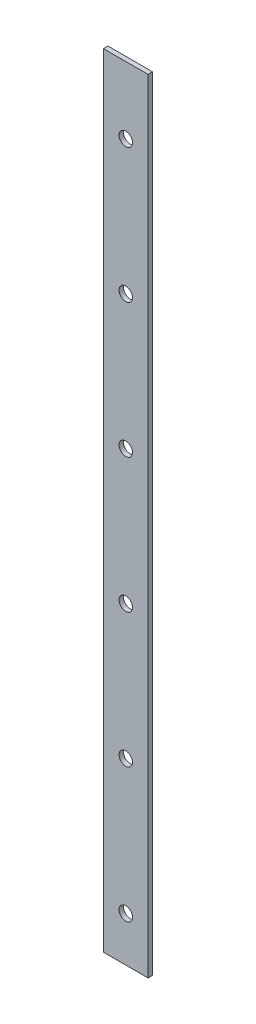
ISO-10303-21;
HEADER;
FILE_DESCRIPTION(('STEP AP214'),'2;1');
FILE_NAME('part.step','',(''),(''),'','','');
FILE_SCHEMA(('AUTOMOTIVE_DESIGN { 1 0 10303 214 1 1 1 1 }'));
ENDSEC;
DATA;
#1=APPLICATION_CONTEXT('core data for automotive mechanical design processes');
#2=APPLICATION_PROTOCOL_DEFINITION('international standard','automotive_design',2000,#1);
#3=PRODUCT_CONTEXT('',#1,'mechanical');
#4=PRODUCT('Part','Part','',(#3));
#5=PRODUCT_RELATED_PRODUCT_CATEGORY('part','',(#4));
#6=PRODUCT_DEFINITION_FORMATION('','',#4);
#7=PRODUCT_DEFINITION_CONTEXT('part definition',#1,'design');
#8=PRODUCT_DEFINITION('design','',#6,#7);
#9=PRODUCT_DEFINITION_SHAPE('','',#8);
#10=(LENGTH_UNIT() NAMED_UNIT(*) SI_UNIT(.MILLI.,.METRE.));
#11=(NAMED_UNIT(*) PLANE_ANGLE_UNIT() SI_UNIT($,.RADIAN.));
#12=(NAMED_UNIT(*) SI_UNIT($,.STERADIAN.) SOLID_ANGLE_UNIT());
#13=UNCERTAINTY_MEASURE_WITH_UNIT(LENGTH_MEASURE(1.E-05),#10,'distance_accuracy_value','');
#14=(GEOMETRIC_REPRESENTATION_CONTEXT(3) GLOBAL_UNCERTAINTY_ASSIGNED_CONTEXT((#13)) GLOBAL_UNIT_ASSIGNED_CONTEXT((#10,
#11,#12)) REPRESENTATION_CONTEXT('',''));
#15=CARTESIAN_POINT('',(0.,0.,0.));
#16=DIRECTION('',(0.,0.,1.));
#17=DIRECTION('',(1.,0.,0.));
#18=AXIS2_PLACEMENT_3D('',#15,#16,#17);
#19=CARTESIAN_POINT('',(0.,320.,-8.));
#20=DIRECTION('',(0.,0.,1.));
#21=DIRECTION('',(1.,0.,0.));
#22=AXIS2_PLACEMENT_3D('',#19,#20,#21);
#23=CYLINDRICAL_SURFACE('',#22,3.);
#24=CARTESIAN_POINT('',(0.,320.,0.));
#25=DIRECTION('',(0.,0.,-1.));
#26=DIRECTION('',(-1.,0.,0.));
#27=AXIS2_PLACEMENT_3D('',#24,#25,#26);
#28=CIRCLE('',#27,3.);
#29=CARTESIAN_POINT('',(-3.,320.,0.));
#30=VERTEX_POINT('',#29);
#31=EDGE_CURVE('E41',#30,#30,#28,.T.);
#32=ORIENTED_EDGE('',*,*,#31,.T.);
#33=EDGE_LOOP('',(#32));
#34=FACE_BOUND('',#33,.T.);
#35=CARTESIAN_POINT('',(0.,320.,2.));
#36=DIRECTION('',(0.,0.,1.));
#37=DIRECTION('',(1.,0.,0.));
#38=AXIS2_PLACEMENT_3D('',#35,#36,#37);
#39=CIRCLE('',#38,3.);
#40=CARTESIAN_POINT('',(3.,320.,2.));
#41=VERTEX_POINT('',#40);
#42=EDGE_CURVE('E11',#41,#41,#39,.T.);
#43=ORIENTED_EDGE('',*,*,#42,.T.);
#44=EDGE_LOOP('',(#43));
#45=FACE_BOUND('',#44,.T.);
#46=ADVANCED_FACE('F33',(#34,#45),#23,.F.);
#47=CARTESIAN_POINT('',(0.,260.,-8.));
#48=DIRECTION('',(0.,0.,1.));
#49=DIRECTION('',(1.,0.,0.));
#50=AXIS2_PLACEMENT_3D('',#47,#48,#49);
#51=CYLINDRICAL_SURFACE('',#50,3.);
#52=CARTESIAN_POINT('',(0.,260.,0.));
#53=DIRECTION('',(0.,0.,-1.));
#54=DIRECTION('',(-1.,0.,0.));
#55=AXIS2_PLACEMENT_3D('',#52,#53,#54);
#56=CIRCLE('',#55,3.);
#57=CARTESIAN_POINT('',(-3.,260.,0.));
#58=VERTEX_POINT('',#57);
#59=EDGE_CURVE('E126',#58,#58,#56,.T.);
#60=ORIENTED_EDGE('',*,*,#59,.T.);
#61=EDGE_LOOP('',(#60));
#62=FACE_BOUND('',#61,.T.);
#63=CARTESIAN_POINT('',(0.,260.,2.));
#64=DIRECTION('',(0.,0.,1.));
#65=DIRECTION('',(1.,0.,0.));
#66=AXIS2_PLACEMENT_3D('',#63,#64,#65);
#67=CIRCLE('',#66,3.);
#68=CARTESIAN_POINT('',(3.,260.,2.));
#69=VERTEX_POINT('',#68);
#70=EDGE_CURVE('E129',#69,#69,#67,.T.);
#71=ORIENTED_EDGE('',*,*,#70,.T.);
#72=EDGE_LOOP('',(#71));
#73=FACE_BOUND('',#72,.T.);
#74=ADVANCED_FACE('F155',(#62,#73),#51,.F.);
#75=CARTESIAN_POINT('',(0.,200.,-8.));
#76=DIRECTION('',(0.,0.,1.));
#77=DIRECTION('',(1.,0.,0.));
#78=AXIS2_PLACEMENT_3D('',#75,#76,#77);
#79=CYLINDRICAL_SURFACE('',#78,3.);
#80=CARTESIAN_POINT('',(0.,200.,0.));
#81=DIRECTION('',(0.,0.,-1.));
#82=DIRECTION('',(-1.,0.,0.));
#83=AXIS2_PLACEMENT_3D('',#80,#81,#82);
#84=CIRCLE('',#83,3.);
#85=CARTESIAN_POINT('',(-3.,200.,0.));
#86=VERTEX_POINT('',#85);
#87=EDGE_CURVE('E120',#86,#86,#84,.T.);
#88=ORIENTED_EDGE('',*,*,#87,.T.);
#89=EDGE_LOOP('',(#88));
#90=FACE_BOUND('',#89,.T.);
#91=CARTESIAN_POINT('',(0.,200.,2.));
#92=DIRECTION('',(0.,0.,1.));
#93=DIRECTION('',(1.,0.,0.));
#94=AXIS2_PLACEMENT_3D('',#91,#92,#93);
#95=CIRCLE('',#94,3.);
#96=CARTESIAN_POINT('',(3.,200.,2.));
#97=VERTEX_POINT('',#96);
#98=EDGE_CURVE('E123',#97,#97,#95,.T.);
#99=ORIENTED_EDGE('',*,*,#98,.T.);
#100=EDGE_LOOP('',(#99));
#101=FACE_BOUND('',#100,.T.);
#102=ADVANCED_FACE('F159',(#90,#101),#79,.F.);
#103=CARTESIAN_POINT('',(0.,140.,-8.));
#104=DIRECTION('',(0.,0.,1.));
#105=DIRECTION('',(1.,0.,0.));
#106=AXIS2_PLACEMENT_3D('',#103,#104,#105);
#107=CYLINDRICAL_SURFACE('',#106,3.);
#108=CARTESIAN_POINT('',(0.,140.,0.));
#109=DIRECTION('',(0.,0.,-1.));
#110=DIRECTION('',(-1.,0.,0.));
#111=AXIS2_PLACEMENT_3D('',#108,#109,#110);
#112=CIRCLE('',#111,3.);
#113=CARTESIAN_POINT('',(-3.,140.,0.));
#114=VERTEX_POINT('',#113);
#115=EDGE_CURVE('E111',#114,#114,#112,.T.);
#116=ORIENTED_EDGE('',*,*,#115,.T.);
#117=EDGE_LOOP('',(#116));
#118=FACE_BOUND('',#117,.T.);
#119=CARTESIAN_POINT('',(0.,140.,2.));
#120=DIRECTION('',(0.,0.,1.));
#121=DIRECTION('',(1.,0.,0.));
#122=AXIS2_PLACEMENT_3D('',#119,#120,#121);
#123=CIRCLE('',#122,3.);
#124=CARTESIAN_POINT('',(3.,140.,2.));
#125=VERTEX_POINT('',#124);
#126=EDGE_CURVE('E117',#125,#125,#123,.T.);
#127=ORIENTED_EDGE('',*,*,#126,.T.);
#128=EDGE_LOOP('',(#127));
#129=FACE_BOUND('',#128,.T.);
#130=ADVANCED_FACE('F164',(#118,#129),#107,.F.);
#131=CARTESIAN_POINT('',(-10.,0.,2.));
#132=DIRECTION('',(1.,0.,0.));
#133=DIRECTION('',(0.,0.,-1.));
#134=AXIS2_PLACEMENT_3D('',#131,#132,#133);
#135=PLANE('',#134);
#136=DIRECTION('',(0.,-1.,0.));
#137=VECTOR('',#136,1.);
#138=CARTESIAN_POINT('',(-10.,0.,0.));
#139=LINE('',#138,#137);
#140=CARTESIAN_POINT('',(-10.,350.,0.));
#141=VERTEX_POINT('',#140);
#142=CARTESIAN_POINT('',(-10.,0.,0.));
#143=VERTEX_POINT('',#142);
#144=EDGE_CURVE('E101',#141,#143,#139,.T.);
#145=ORIENTED_EDGE('',*,*,#144,.T.);
#146=DIRECTION('',(0.,0.,-1.));
#147=VECTOR('',#146,1.);
#148=CARTESIAN_POINT('',(-10.,0.,2.));
#149=LINE('',#148,#147);
#150=CARTESIAN_POINT('',(-10.,0.,2.));
#151=VERTEX_POINT('',#150);
#152=EDGE_CURVE('E92',#151,#143,#149,.T.);
#153=ORIENTED_EDGE('',*,*,#152,.F.);
#154=DIRECTION('',(0.,-1.,0.));
#155=VECTOR('',#154,1.);
#156=CARTESIAN_POINT('',(-10.,0.,2.));
#157=LINE('',#156,#155);
#158=CARTESIAN_POINT('',(-10.,350.,2.));
#159=VERTEX_POINT('',#158);
#160=EDGE_CURVE('E86',#159,#151,#157,.T.);
#161=ORIENTED_EDGE('',*,*,#160,.F.);
#162=DIRECTION('',(0.,0.,-1.));
#163=VECTOR('',#162,1.);
#164=CARTESIAN_POINT('',(-10.,350.,2.));
#165=LINE('',#164,#163);
#166=EDGE_CURVE('E97',#159,#141,#165,.T.);
#167=ORIENTED_EDGE('',*,*,#166,.T.);
#168=EDGE_LOOP('',(#145,#153,#161,#167));
#169=FACE_BOUND('',#168,.T.);
#170=ADVANCED_FACE('F171',(#169),#135,.F.);
#171=CARTESIAN_POINT('',(-10.,0.,2.));
#172=DIRECTION('',(0.,1.,0.));
#173=DIRECTION('',(0.,0.,1.));
#174=AXIS2_PLACEMENT_3D('',#171,#172,#173);
#175=PLANE('',#174);
#176=DIRECTION('',(1.,0.,0.));
#177=VECTOR('',#176,1.);
#178=CARTESIAN_POINT('',(-10.,0.,0.));
#179=LINE('',#178,#177);
#180=CARTESIAN_POINT('',(10.,0.,0.));
#181=VERTEX_POINT('',#180);
#182=EDGE_CURVE('E91',#143,#181,#179,.T.);
#183=ORIENTED_EDGE('',*,*,#182,.T.);
#184=DIRECTION('',(0.,0.,-1.));
#185=VECTOR('',#184,1.);
#186=CARTESIAN_POINT('',(10.,0.,2.));
#187=LINE('',#186,#185);
#188=CARTESIAN_POINT('',(10.,0.,2.));
#189=VERTEX_POINT('',#188);
#190=EDGE_CURVE('E89',#189,#181,#187,.T.);
#191=ORIENTED_EDGE('',*,*,#190,.F.);
#192=DIRECTION('',(1.,0.,0.));
#193=VECTOR('',#192,1.);
#194=CARTESIAN_POINT('',(-10.,0.,2.));
#195=LINE('',#194,#193);
#196=EDGE_CURVE('E80',#151,#189,#195,.T.);
#197=ORIENTED_EDGE('',*,*,#196,.F.);
#198=ORIENTED_EDGE('',*,*,#152,.T.);
#199=EDGE_LOOP('',(#183,#191,#197,#198));
#200=FACE_BOUND('',#199,.T.);
#201=ADVANCED_FACE('F90',(#200),#175,.F.);
#202=CARTESIAN_POINT('',(10.,0.,2.));
#203=DIRECTION('',(-1.,0.,0.));
#204=DIRECTION('',(0.,0.,1.));
#205=AXIS2_PLACEMENT_3D('',#202,#203,#204);
#206=PLANE('',#205);
#207=DIRECTION('',(0.,1.,0.));
#208=VECTOR('',#207,1.);
#209=CARTESIAN_POINT('',(10.,0.,0.));
#210=LINE('',#209,#208);
#211=CARTESIAN_POINT('',(10.,350.,0.));
#212=VERTEX_POINT('',#211);
#213=EDGE_CURVE('E66',#181,#212,#210,.T.);
#214=ORIENTED_EDGE('',*,*,#213,.T.);
#215=DIRECTION('',(0.,0.,-1.));
#216=VECTOR('',#215,1.);
#217=CARTESIAN_POINT('',(10.,350.,2.));
#218=LINE('',#217,#216);
#219=CARTESIAN_POINT('',(10.,350.,2.));
#220=VERTEX_POINT('',#219);
#221=EDGE_CURVE('E93',#220,#212,#218,.T.);
#222=ORIENTED_EDGE('',*,*,#221,.F.);
#223=DIRECTION('',(0.,1.,0.));
#224=VECTOR('',#223,1.);
#225=CARTESIAN_POINT('',(10.,0.,2.));
#226=LINE('',#225,#224);
#227=EDGE_CURVE('E84',#189,#220,#226,.T.);
#228=ORIENTED_EDGE('',*,*,#227,.F.);
#229=ORIENTED_EDGE('',*,*,#190,.T.);
#230=EDGE_LOOP('',(#214,#222,#228,#229));
#231=FACE_BOUND('',#230,.T.);
#232=ADVANCED_FACE('F95',(#231),#206,.F.);
#233=CARTESIAN_POINT('',(-10.,350.,2.));
#234=DIRECTION('',(0.,-1.,0.));
#235=DIRECTION('',(0.,0.,-1.));
#236=AXIS2_PLACEMENT_3D('',#233,#234,#235);
#237=PLANE('',#236);
#238=DIRECTION('',(-1.,0.,0.));
#239=VECTOR('',#238,1.);
#240=CARTESIAN_POINT('',(-10.,350.,0.));
#241=LINE('',#240,#239);
#242=EDGE_CURVE('E72',#212,#141,#241,.T.);
#243=ORIENTED_EDGE('',*,*,#242,.T.);
#244=ORIENTED_EDGE('',*,*,#166,.F.);
#245=DIRECTION('',(-1.,0.,0.));
#246=VECTOR('',#245,1.);
#247=CARTESIAN_POINT('',(-10.,350.,2.));
#248=LINE('',#247,#246);
#249=EDGE_CURVE('E49',#220,#159,#248,.T.);
#250=ORIENTED_EDGE('',*,*,#249,.F.);
#251=ORIENTED_EDGE('',*,*,#221,.T.);
#252=EDGE_LOOP('',(#243,#244,#250,#251));
#253=FACE_BOUND('',#252,.T.);
#254=ADVANCED_FACE('F148',(#253),#237,.F.);
#255=CARTESIAN_POINT('',(0.,0.,2.));
#256=DIRECTION('',(0.,0.,-1.));
#257=DIRECTION('',(-1.,0.,0.));
#258=AXIS2_PLACEMENT_3D('',#255,#256,#257);
#259=PLANE('',#258);
#260=CARTESIAN_POINT('',(0.,80.,2.));
#261=DIRECTION('',(0.,0.,1.));
#262=DIRECTION('',(1.,0.,0.));
#263=AXIS2_PLACEMENT_3D('',#260,#261,#262);
#264=CIRCLE('',#263,3.);
#265=CARTESIAN_POINT('',(3.,80.,2.));
#266=VERTEX_POINT('',#265);
#267=EDGE_CURVE('E254',#266,#266,#264,.T.);
#268=ORIENTED_EDGE('',*,*,#267,.F.);
#269=EDGE_LOOP('',(#268));
#270=FACE_BOUND('',#269,.T.);
#271=CARTESIAN_POINT('',(0.,20.,2.));
#272=DIRECTION('',(0.,0.,1.));
#273=DIRECTION('',(1.,0.,0.));
#274=AXIS2_PLACEMENT_3D('',#271,#272,#273);
#275=CIRCLE('',#274,3.);
#276=CARTESIAN_POINT('',(3.,20.,2.));
#277=VERTEX_POINT('',#276);
#278=EDGE_CURVE('E114',#277,#277,#275,.T.);
#279=ORIENTED_EDGE('',*,*,#278,.F.);
#280=EDGE_LOOP('',(#279));
#281=FACE_BOUND('',#280,.T.);
#282=ORIENTED_EDGE('',*,*,#160,.T.);
#283=ORIENTED_EDGE('',*,*,#196,.T.);
#284=ORIENTED_EDGE('',*,*,#227,.T.);
#285=ORIENTED_EDGE('',*,*,#249,.T.);
#286=EDGE_LOOP('',(#282,#283,#284,#285));
#287=FACE_BOUND('',#286,.T.);
#288=ORIENTED_EDGE('',*,*,#126,.F.);
#289=EDGE_LOOP('',(#288));
#290=FACE_BOUND('',#289,.T.);
#291=ORIENTED_EDGE('',*,*,#98,.F.);
#292=EDGE_LOOP('',(#291));
#293=FACE_BOUND('',#292,.T.);
#294=ORIENTED_EDGE('',*,*,#70,.F.);
#295=EDGE_LOOP('',(#294));
#296=FACE_BOUND('',#295,.T.);
#297=ORIENTED_EDGE('',*,*,#42,.F.);
#298=EDGE_LOOP('',(#297));
#299=FACE_BOUND('',#298,.T.);
#300=ADVANCED_FACE('F81',(#270,#281,#287,#290,#293,#296,#299),#259,.F.);
#301=CARTESIAN_POINT('',(0.,0.,0.));
#302=DIRECTION('',(0.,0.,-1.));
#303=DIRECTION('',(-1.,0.,0.));
#304=AXIS2_PLACEMENT_3D('',#301,#302,#303);
#305=PLANE('',#304);
#306=CARTESIAN_POINT('',(0.,80.,0.));
#307=DIRECTION('',(0.,0.,-1.));
#308=DIRECTION('',(-1.,0.,0.));
#309=AXIS2_PLACEMENT_3D('',#306,#307,#308);
#310=CIRCLE('',#309,3.);
#311=CARTESIAN_POINT('',(-3.,80.,0.));
#312=VERTEX_POINT('',#311);
#313=EDGE_CURVE('E251',#312,#312,#310,.T.);
#314=ORIENTED_EDGE('',*,*,#313,.F.);
#315=EDGE_LOOP('',(#314));
#316=FACE_BOUND('',#315,.T.);
#317=CARTESIAN_POINT('',(0.,20.,0.));
#318=DIRECTION('',(0.,0.,-1.));
#319=DIRECTION('',(-1.,0.,0.));
#320=AXIS2_PLACEMENT_3D('',#317,#318,#319);
#321=CIRCLE('',#320,3.);
#322=CARTESIAN_POINT('',(-3.,20.,0.));
#323=VERTEX_POINT('',#322);
#324=EDGE_CURVE('E104',#323,#323,#321,.T.);
#325=ORIENTED_EDGE('',*,*,#324,.F.);
#326=EDGE_LOOP('',(#325));
#327=FACE_BOUND('',#326,.T.);
#328=ORIENTED_EDGE('',*,*,#144,.F.);
#329=ORIENTED_EDGE('',*,*,#242,.F.);
#330=ORIENTED_EDGE('',*,*,#213,.F.);
#331=ORIENTED_EDGE('',*,*,#182,.F.);
#332=EDGE_LOOP('',(#328,#329,#330,#331));
#333=FACE_BOUND('',#332,.T.);
#334=ORIENTED_EDGE('',*,*,#115,.F.);
#335=EDGE_LOOP('',(#334));
#336=FACE_BOUND('',#335,.T.);
#337=ORIENTED_EDGE('',*,*,#87,.F.);
#338=EDGE_LOOP('',(#337));
#339=FACE_BOUND('',#338,.T.);
#340=ORIENTED_EDGE('',*,*,#59,.F.);
#341=EDGE_LOOP('',(#340));
#342=FACE_BOUND('',#341,.T.);
#343=ORIENTED_EDGE('',*,*,#31,.F.);
#344=EDGE_LOOP('',(#343));
#345=FACE_BOUND('',#344,.T.);
#346=ADVANCED_FACE('F136',(#316,#327,#333,#336,#339,#342,#345),#305,.T.);
#347=CARTESIAN_POINT('',(0.,20.,-8.));
#348=DIRECTION('',(0.,0.,1.));
#349=DIRECTION('',(1.,0.,0.));
#350=AXIS2_PLACEMENT_3D('',#347,#348,#349);
#351=CYLINDRICAL_SURFACE('',#350,3.);
#352=ORIENTED_EDGE('',*,*,#324,.T.);
#353=EDGE_LOOP('',(#352));
#354=FACE_BOUND('',#353,.T.);
#355=ORIENTED_EDGE('',*,*,#278,.T.);
#356=EDGE_LOOP('',(#355));
#357=FACE_BOUND('',#356,.T.);
#358=ADVANCED_FACE('F138',(#354,#357),#351,.F.);
#359=CARTESIAN_POINT('',(0.,80.,-8.));
#360=DIRECTION('',(0.,0.,1.));
#361=DIRECTION('',(1.,0.,0.));
#362=AXIS2_PLACEMENT_3D('',#359,#360,#361);
#363=CYLINDRICAL_SURFACE('',#362,3.);
#364=ORIENTED_EDGE('',*,*,#313,.T.);
#365=EDGE_LOOP('',(#364));
#366=FACE_BOUND('',#365,.T.);
#367=ORIENTED_EDGE('',*,*,#267,.T.);
#368=EDGE_LOOP('',(#367));
#369=FACE_BOUND('',#368,.T.);
#370=ADVANCED_FACE('F145',(#366,#369),#363,.F.);
#371=CLOSED_SHELL('',(#46,#74,#102,#130,#170,#201,#232,#254,#300,#346,#358,#370));
#372=MANIFOLD_SOLID_BREP('B2',#371);
#373=ADVANCED_BREP_SHAPE_REPRESENTATION('',(#18,#372),#14);
#374=SHAPE_DEFINITION_REPRESENTATION(#9,#373);
ENDSEC;
END-ISO-10303-21;
